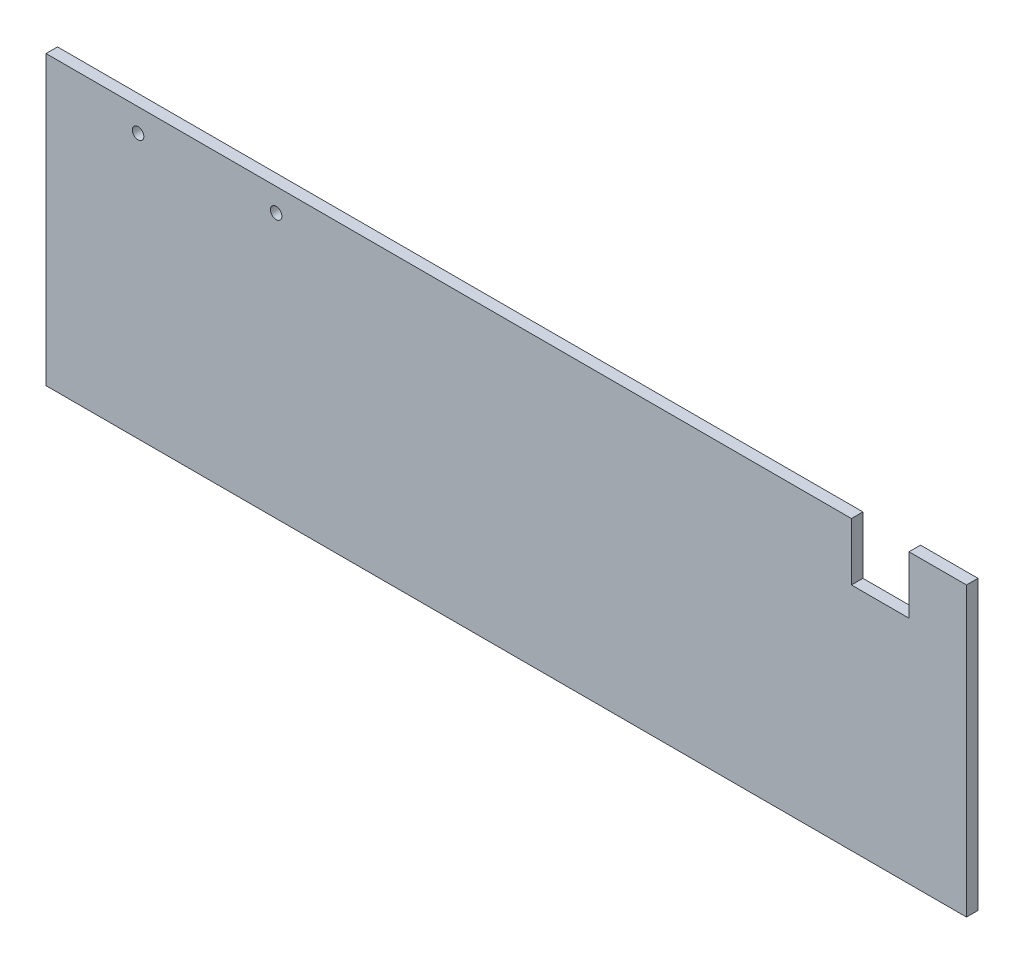
ISO-10303-21;
HEADER;
FILE_DESCRIPTION(('STEP AP214'),'2;1');
FILE_NAME('part.step','',(''),(''),'','','');
FILE_SCHEMA(('AUTOMOTIVE_DESIGN { 1 0 10303 214 1 1 1 1 }'));
ENDSEC;
DATA;
#1=APPLICATION_CONTEXT('core data for automotive mechanical design processes');
#2=APPLICATION_PROTOCOL_DEFINITION('international standard','automotive_design',2000,#1);
#3=PRODUCT_CONTEXT('',#1,'mechanical');
#4=PRODUCT('Part','Part','',(#3));
#5=PRODUCT_RELATED_PRODUCT_CATEGORY('part','',(#4));
#6=PRODUCT_DEFINITION_FORMATION('','',#4);
#7=PRODUCT_DEFINITION_CONTEXT('part definition',#1,'design');
#8=PRODUCT_DEFINITION('design','',#6,#7);
#9=PRODUCT_DEFINITION_SHAPE('','',#8);
#10=(LENGTH_UNIT() NAMED_UNIT(*) SI_UNIT(.MILLI.,.METRE.));
#11=(NAMED_UNIT(*) PLANE_ANGLE_UNIT() SI_UNIT($,.RADIAN.));
#12=(NAMED_UNIT(*) SI_UNIT($,.STERADIAN.) SOLID_ANGLE_UNIT());
#13=UNCERTAINTY_MEASURE_WITH_UNIT(LENGTH_MEASURE(1.E-05),#10,'distance_accuracy_value','');
#14=(GEOMETRIC_REPRESENTATION_CONTEXT(3) GLOBAL_UNCERTAINTY_ASSIGNED_CONTEXT((#13)) GLOBAL_UNIT_ASSIGNED_CONTEXT((#10,
#11,#12)) REPRESENTATION_CONTEXT('',''));
#15=CARTESIAN_POINT('',(0.,0.,0.));
#16=DIRECTION('',(0.,0.,1.));
#17=DIRECTION('',(1.,0.,0.));
#18=AXIS2_PLACEMENT_3D('',#15,#16,#17);
#19=CARTESIAN_POINT('',(300.,125.,10.));
#20=DIRECTION('',(0.,-1.,0.));
#21=DIRECTION('',(1.,0.,0.));
#22=AXIS2_PLACEMENT_3D('',#19,#20,#21);
#23=PLANE('',#22);
#24=DIRECTION('',(-1.,0.,0.));
#25=VECTOR('',#24,1.);
#26=CARTESIAN_POINT('',(300.,125.,0.));
#27=LINE('',#26,#25);
#28=CARTESIAN_POINT('',(300.,125.,0.));
#29=VERTEX_POINT('',#28);
#30=CARTESIAN_POINT('',(-400.,125.,0.));
#31=VERTEX_POINT('',#30);
#32=EDGE_CURVE('E140',#29,#31,#27,.T.);
#33=ORIENTED_EDGE('',*,*,#32,.T.);
#34=DIRECTION('',(0.,0.,-1.));
#35=VECTOR('',#34,1.);
#36=CARTESIAN_POINT('',(-400.,125.,10.));
#37=LINE('',#36,#35);
#38=CARTESIAN_POINT('',(-400.,125.,10.));
#39=VERTEX_POINT('',#38);
#40=EDGE_CURVE('E11',#39,#31,#37,.T.);
#41=ORIENTED_EDGE('',*,*,#40,.F.);
#42=DIRECTION('',(-1.,0.,0.));
#43=VECTOR('',#42,1.);
#44=CARTESIAN_POINT('',(300.,125.,10.));
#45=LINE('',#44,#43);
#46=CARTESIAN_POINT('',(300.,125.,10.));
#47=VERTEX_POINT('',#46);
#48=EDGE_CURVE('E163',#47,#39,#45,.T.);
#49=ORIENTED_EDGE('',*,*,#48,.F.);
#50=DIRECTION('',(0.,0.,-1.));
#51=VECTOR('',#50,1.);
#52=CARTESIAN_POINT('',(300.,125.,10.));
#53=LINE('',#52,#51);
#54=EDGE_CURVE('E136',#47,#29,#53,.T.);
#55=ORIENTED_EDGE('',*,*,#54,.T.);
#56=EDGE_LOOP('',(#33,#41,#49,#55));
#57=FACE_BOUND('',#56,.T.);
#58=ADVANCED_FACE('F39',(#57),#23,.F.);
#59=CARTESIAN_POINT('',(-400.,-125.,10.));
#60=DIRECTION('',(1.,0.,0.));
#61=DIRECTION('',(0.,0.,-1.));
#62=AXIS2_PLACEMENT_3D('',#59,#60,#61);
#63=PLANE('',#62);
#64=DIRECTION('',(0.,-1.,0.));
#65=VECTOR('',#64,1.);
#66=CARTESIAN_POINT('',(-400.,-125.,0.));
#67=LINE('',#66,#65);
#68=CARTESIAN_POINT('',(-400.,-125.,0.));
#69=VERTEX_POINT('',#68);
#70=EDGE_CURVE('E144',#31,#69,#67,.T.);
#71=ORIENTED_EDGE('',*,*,#70,.T.);
#72=DIRECTION('',(0.,0.,-1.));
#73=VECTOR('',#72,1.);
#74=CARTESIAN_POINT('',(-400.,-125.,10.));
#75=LINE('',#74,#73);
#76=CARTESIAN_POINT('',(-400.,-125.,10.));
#77=VERTEX_POINT('',#76);
#78=EDGE_CURVE('E48',#77,#69,#75,.T.);
#79=ORIENTED_EDGE('',*,*,#78,.F.);
#80=DIRECTION('',(0.,-1.,0.));
#81=VECTOR('',#80,1.);
#82=CARTESIAN_POINT('',(-400.,-125.,10.));
#83=LINE('',#82,#81);
#84=EDGE_CURVE('E99',#39,#77,#83,.T.);
#85=ORIENTED_EDGE('',*,*,#84,.F.);
#86=ORIENTED_EDGE('',*,*,#40,.T.);
#87=EDGE_LOOP('',(#71,#79,#85,#86));
#88=FACE_BOUND('',#87,.T.);
#89=ADVANCED_FACE('F245',(#88),#63,.F.);
#90=CARTESIAN_POINT('',(400.,-125.,10.));
#91=DIRECTION('',(0.,1.,0.));
#92=DIRECTION('',(-1.,0.,0.));
#93=AXIS2_PLACEMENT_3D('',#90,#91,#92);
#94=PLANE('',#93);
#95=DIRECTION('',(1.,0.,0.));
#96=VECTOR('',#95,1.);
#97=CARTESIAN_POINT('',(400.,-125.,0.));
#98=LINE('',#97,#96);
#99=CARTESIAN_POINT('',(400.,-125.,0.));
#100=VERTEX_POINT('',#99);
#101=EDGE_CURVE('E148',#69,#100,#98,.T.);
#102=ORIENTED_EDGE('',*,*,#101,.T.);
#103=DIRECTION('',(0.,0.,-1.));
#104=VECTOR('',#103,1.);
#105=CARTESIAN_POINT('',(400.,-125.,10.));
#106=LINE('',#105,#104);
#107=CARTESIAN_POINT('',(400.,-125.,10.));
#108=VERTEX_POINT('',#107);
#109=EDGE_CURVE('E174',#108,#100,#106,.T.);
#110=ORIENTED_EDGE('',*,*,#109,.F.);
#111=DIRECTION('',(1.,0.,0.));
#112=VECTOR('',#111,1.);
#113=CARTESIAN_POINT('',(400.,-125.,10.));
#114=LINE('',#113,#112);
#115=EDGE_CURVE('E184',#77,#108,#114,.T.);
#116=ORIENTED_EDGE('',*,*,#115,.F.);
#117=ORIENTED_EDGE('',*,*,#78,.T.);
#118=EDGE_LOOP('',(#102,#110,#116,#117));
#119=FACE_BOUND('',#118,.T.);
#120=ADVANCED_FACE('F182',(#119),#94,.F.);
#121=CARTESIAN_POINT('',(400.,-125.,10.));
#122=DIRECTION('',(-1.,0.,0.));
#123=DIRECTION('',(0.,0.,1.));
#124=AXIS2_PLACEMENT_3D('',#121,#122,#123);
#125=PLANE('',#124);
#126=DIRECTION('',(0.,1.,0.));
#127=VECTOR('',#126,1.);
#128=CARTESIAN_POINT('',(400.,-125.,0.));
#129=LINE('',#128,#127);
#130=CARTESIAN_POINT('',(400.,125.,0.));
#131=VERTEX_POINT('',#130);
#132=EDGE_CURVE('E151',#100,#131,#129,.T.);
#133=ORIENTED_EDGE('',*,*,#132,.T.);
#134=DIRECTION('',(0.,0.,-1.));
#135=VECTOR('',#134,1.);
#136=CARTESIAN_POINT('',(400.,125.,10.));
#137=LINE('',#136,#135);
#138=CARTESIAN_POINT('',(400.,125.,10.));
#139=VERTEX_POINT('',#138);
#140=EDGE_CURVE('E170',#139,#131,#137,.T.);
#141=ORIENTED_EDGE('',*,*,#140,.F.);
#142=DIRECTION('',(0.,1.,0.));
#143=VECTOR('',#142,1.);
#144=CARTESIAN_POINT('',(400.,-125.,10.));
#145=LINE('',#144,#143);
#146=EDGE_CURVE('E197',#108,#139,#145,.T.);
#147=ORIENTED_EDGE('',*,*,#146,.F.);
#148=ORIENTED_EDGE('',*,*,#109,.T.);
#149=EDGE_LOOP('',(#133,#141,#147,#148));
#150=FACE_BOUND('',#149,.T.);
#151=ADVANCED_FACE('F192',(#150),#125,.F.);
#152=CARTESIAN_POINT('',(400.,125.,10.));
#153=DIRECTION('',(0.,-1.,0.));
#154=DIRECTION('',(1.,0.,0.));
#155=AXIS2_PLACEMENT_3D('',#152,#153,#154);
#156=PLANE('',#155);
#157=DIRECTION('',(-1.,0.,0.));
#158=VECTOR('',#157,1.);
#159=CARTESIAN_POINT('',(400.,125.,0.));
#160=LINE('',#159,#158);
#161=CARTESIAN_POINT('',(350.,125.,0.));
#162=VERTEX_POINT('',#161);
#163=EDGE_CURVE('E154',#131,#162,#160,.T.);
#164=ORIENTED_EDGE('',*,*,#163,.T.);
#165=DIRECTION('',(0.,0.,-1.));
#166=VECTOR('',#165,1.);
#167=CARTESIAN_POINT('',(350.,125.,10.));
#168=LINE('',#167,#166);
#169=CARTESIAN_POINT('',(350.,125.,10.));
#170=VERTEX_POINT('',#169);
#171=EDGE_CURVE('E129',#170,#162,#168,.T.);
#172=ORIENTED_EDGE('',*,*,#171,.F.);
#173=DIRECTION('',(-1.,0.,0.));
#174=VECTOR('',#173,1.);
#175=CARTESIAN_POINT('',(400.,125.,10.));
#176=LINE('',#175,#174);
#177=EDGE_CURVE('E118',#139,#170,#176,.T.);
#178=ORIENTED_EDGE('',*,*,#177,.F.);
#179=ORIENTED_EDGE('',*,*,#140,.T.);
#180=EDGE_LOOP('',(#164,#172,#178,#179));
#181=FACE_BOUND('',#180,.T.);
#182=ADVANCED_FACE('F195',(#181),#156,.F.);
#183=CARTESIAN_POINT('',(350.,75.0000000000001,10.));
#184=DIRECTION('',(1.,0.,0.));
#185=DIRECTION('',(0.,1.,0.));
#186=AXIS2_PLACEMENT_3D('',#183,#184,#185);
#187=PLANE('',#186);
#188=DIRECTION('',(0.,-1.,0.));
#189=VECTOR('',#188,1.);
#190=CARTESIAN_POINT('',(350.,75.0000000000001,0.));
#191=LINE('',#190,#189);
#192=CARTESIAN_POINT('',(350.,75.0000000000001,0.));
#193=VERTEX_POINT('',#192);
#194=EDGE_CURVE('E127',#162,#193,#191,.T.);
#195=ORIENTED_EDGE('',*,*,#194,.T.);
#196=DIRECTION('',(0.,0.,-1.));
#197=VECTOR('',#196,1.);
#198=CARTESIAN_POINT('',(350.,75.0000000000001,10.));
#199=LINE('',#198,#197);
#200=CARTESIAN_POINT('',(350.,75.0000000000001,10.));
#201=VERTEX_POINT('',#200);
#202=EDGE_CURVE('E124',#201,#193,#199,.T.);
#203=ORIENTED_EDGE('',*,*,#202,.F.);
#204=DIRECTION('',(0.,-1.,0.));
#205=VECTOR('',#204,1.);
#206=CARTESIAN_POINT('',(350.,75.0000000000001,10.));
#207=LINE('',#206,#205);
#208=EDGE_CURVE('E112',#170,#201,#207,.T.);
#209=ORIENTED_EDGE('',*,*,#208,.F.);
#210=ORIENTED_EDGE('',*,*,#171,.T.);
#211=EDGE_LOOP('',(#195,#203,#209,#210));
#212=FACE_BOUND('',#211,.T.);
#213=ADVANCED_FACE('F125',(#212),#187,.F.);
#214=CARTESIAN_POINT('',(300.,75.0000000000001,10.));
#215=DIRECTION('',(0.,-1.,0.));
#216=DIRECTION('',(0.,0.,-1.));
#217=AXIS2_PLACEMENT_3D('',#214,#215,#216);
#218=PLANE('',#217);
#219=DIRECTION('',(-1.,0.,0.));
#220=VECTOR('',#219,1.);
#221=CARTESIAN_POINT('',(300.,75.0000000000001,0.));
#222=LINE('',#221,#220);
#223=CARTESIAN_POINT('',(300.,75.0000000000001,0.));
#224=VERTEX_POINT('',#223);
#225=EDGE_CURVE('E85',#193,#224,#222,.T.);
#226=ORIENTED_EDGE('',*,*,#225,.T.);
#227=DIRECTION('',(0.,0.,-1.));
#228=VECTOR('',#227,1.);
#229=CARTESIAN_POINT('',(300.,75.0000000000001,10.));
#230=LINE('',#229,#228);
#231=CARTESIAN_POINT('',(300.,75.0000000000001,10.));
#232=VERTEX_POINT('',#231);
#233=EDGE_CURVE('E130',#232,#224,#230,.T.);
#234=ORIENTED_EDGE('',*,*,#233,.F.);
#235=DIRECTION('',(-1.,0.,0.));
#236=VECTOR('',#235,1.);
#237=CARTESIAN_POINT('',(300.,75.0000000000001,10.));
#238=LINE('',#237,#236);
#239=EDGE_CURVE('E116',#201,#232,#238,.T.);
#240=ORIENTED_EDGE('',*,*,#239,.F.);
#241=ORIENTED_EDGE('',*,*,#202,.T.);
#242=EDGE_LOOP('',(#226,#234,#240,#241));
#243=FACE_BOUND('',#242,.T.);
#244=ADVANCED_FACE('F132',(#243),#218,.F.);
#245=CARTESIAN_POINT('',(300.,125.,10.));
#246=DIRECTION('',(-1.,0.,0.));
#247=DIRECTION('',(0.,0.,1.));
#248=AXIS2_PLACEMENT_3D('',#245,#246,#247);
#249=PLANE('',#248);
#250=DIRECTION('',(0.,1.,0.));
#251=VECTOR('',#250,1.);
#252=CARTESIAN_POINT('',(300.,125.,0.));
#253=LINE('',#252,#251);
#254=EDGE_CURVE('E91',#224,#29,#253,.T.);
#255=ORIENTED_EDGE('',*,*,#254,.T.);
#256=ORIENTED_EDGE('',*,*,#54,.F.);
#257=DIRECTION('',(0.,1.,0.));
#258=VECTOR('',#257,1.);
#259=CARTESIAN_POINT('',(300.,125.,10.));
#260=LINE('',#259,#258);
#261=EDGE_CURVE('E56',#232,#47,#260,.T.);
#262=ORIENTED_EDGE('',*,*,#261,.F.);
#263=ORIENTED_EDGE('',*,*,#233,.T.);
#264=EDGE_LOOP('',(#255,#256,#262,#263));
#265=FACE_BOUND('',#264,.T.);
#266=ADVANCED_FACE('F227',(#265),#249,.F.);
#267=CARTESIAN_POINT('',(0.,0.,10.));
#268=DIRECTION('',(0.,0.,-1.));
#269=DIRECTION('',(-1.,0.,0.));
#270=AXIS2_PLACEMENT_3D('',#267,#268,#269);
#271=PLANE('',#270);
#272=CARTESIAN_POINT('',(-200.,105.,10.));
#273=DIRECTION('',(0.,0.,1.));
#274=DIRECTION('',(1.,0.,0.));
#275=AXIS2_PLACEMENT_3D('',#272,#273,#274);
#276=CIRCLE('',#275,5.00000000000002);
#277=CARTESIAN_POINT('',(-195.,105.,10.));
#278=VERTEX_POINT('',#277);
#279=EDGE_CURVE('E145',#278,#278,#276,.T.);
#280=ORIENTED_EDGE('',*,*,#279,.F.);
#281=EDGE_LOOP('',(#280));
#282=FACE_BOUND('',#281,.T.);
#283=CARTESIAN_POINT('',(-320.,105.,10.));
#284=DIRECTION('',(0.,0.,1.));
#285=DIRECTION('',(-1.,0.,0.));
#286=AXIS2_PLACEMENT_3D('',#283,#284,#285);
#287=CIRCLE('',#286,4.99999999999999);
#288=CARTESIAN_POINT('',(-325.,105.,10.));
#289=VERTEX_POINT('',#288);
#290=EDGE_CURVE('E211',#289,#289,#287,.T.);
#291=ORIENTED_EDGE('',*,*,#290,.F.);
#292=EDGE_LOOP('',(#291));
#293=FACE_BOUND('',#292,.T.);
#294=ORIENTED_EDGE('',*,*,#48,.T.);
#295=ORIENTED_EDGE('',*,*,#84,.T.);
#296=ORIENTED_EDGE('',*,*,#115,.T.);
#297=ORIENTED_EDGE('',*,*,#146,.T.);
#298=ORIENTED_EDGE('',*,*,#177,.T.);
#299=ORIENTED_EDGE('',*,*,#208,.T.);
#300=ORIENTED_EDGE('',*,*,#239,.T.);
#301=ORIENTED_EDGE('',*,*,#261,.T.);
#302=EDGE_LOOP('',(#294,#295,#296,#297,#298,#299,#300,#301));
#303=FACE_BOUND('',#302,.T.);
#304=ADVANCED_FACE('F114',(#282,#293,#303),#271,.F.);
#305=CARTESIAN_POINT('',(0.,0.,0.));
#306=DIRECTION('',(0.,0.,-1.));
#307=DIRECTION('',(-1.,0.,0.));
#308=AXIS2_PLACEMENT_3D('',#305,#306,#307);
#309=PLANE('',#308);
#310=CARTESIAN_POINT('',(-200.,105.,0.));
#311=DIRECTION('',(0.,0.,-1.));
#312=DIRECTION('',(-1.,0.,0.));
#313=AXIS2_PLACEMENT_3D('',#310,#311,#312);
#314=CIRCLE('',#313,5.00000000000002);
#315=CARTESIAN_POINT('',(-205.,105.,0.));
#316=VERTEX_POINT('',#315);
#317=EDGE_CURVE('E215',#316,#316,#314,.F.);
#318=ORIENTED_EDGE('',*,*,#317,.T.);
#319=EDGE_LOOP('',(#318));
#320=FACE_BOUND('',#319,.T.);
#321=CARTESIAN_POINT('',(-320.,105.,0.));
#322=DIRECTION('',(0.,0.,-1.));
#323=DIRECTION('',(-1.,0.,0.));
#324=AXIS2_PLACEMENT_3D('',#321,#322,#323);
#325=CIRCLE('',#324,4.99999999999999);
#326=CARTESIAN_POINT('',(-325.,105.,0.));
#327=VERTEX_POINT('',#326);
#328=EDGE_CURVE('E207',#327,#327,#325,.F.);
#329=ORIENTED_EDGE('',*,*,#328,.T.);
#330=EDGE_LOOP('',(#329));
#331=FACE_BOUND('',#330,.T.);
#332=ORIENTED_EDGE('',*,*,#32,.F.);
#333=ORIENTED_EDGE('',*,*,#254,.F.);
#334=ORIENTED_EDGE('',*,*,#225,.F.);
#335=ORIENTED_EDGE('',*,*,#194,.F.);
#336=ORIENTED_EDGE('',*,*,#163,.F.);
#337=ORIENTED_EDGE('',*,*,#132,.F.);
#338=ORIENTED_EDGE('',*,*,#101,.F.);
#339=ORIENTED_EDGE('',*,*,#70,.F.);
#340=EDGE_LOOP('',(#332,#333,#334,#335,#336,#337,#338,#339));
#341=FACE_BOUND('',#340,.T.);
#342=ADVANCED_FACE('F188',(#320,#331,#341),#309,.T.);
#343=CARTESIAN_POINT('',(-320.,105.,-0.000999999999999265));
#344=DIRECTION('',(0.,0.,1.));
#345=DIRECTION('',(1.,0.,0.));
#346=AXIS2_PLACEMENT_3D('',#343,#344,#345);
#347=CYLINDRICAL_SURFACE('',#346,4.99999999999999);
#348=ORIENTED_EDGE('',*,*,#328,.F.);
#349=EDGE_LOOP('',(#348));
#350=FACE_BOUND('',#349,.T.);
#351=ORIENTED_EDGE('',*,*,#290,.T.);
#352=EDGE_LOOP('',(#351));
#353=FACE_BOUND('',#352,.T.);
#354=ADVANCED_FACE('F231',(#350,#353),#347,.F.);
#355=CARTESIAN_POINT('',(-200.,105.,-0.000999999999999265));
#356=DIRECTION('',(0.,0.,1.));
#357=DIRECTION('',(1.,0.,0.));
#358=AXIS2_PLACEMENT_3D('',#355,#356,#357);
#359=CYLINDRICAL_SURFACE('',#358,5.00000000000002);
#360=ORIENTED_EDGE('',*,*,#317,.F.);
#361=EDGE_LOOP('',(#360));
#362=FACE_BOUND('',#361,.T.);
#363=ORIENTED_EDGE('',*,*,#279,.T.);
#364=EDGE_LOOP('',(#363));
#365=FACE_BOUND('',#364,.T.);
#366=ADVANCED_FACE('F223',(#362,#365),#359,.F.);
#367=CLOSED_SHELL('',(#58,#89,#120,#151,#182,#213,#244,#266,#304,#342,#354,#366));
#368=MANIFOLD_SOLID_BREP('B2',#367);
#369=ADVANCED_BREP_SHAPE_REPRESENTATION('',(#18,#368),#14);
#370=SHAPE_DEFINITION_REPRESENTATION(#9,#369);
ENDSEC;
END-ISO-10303-21;
